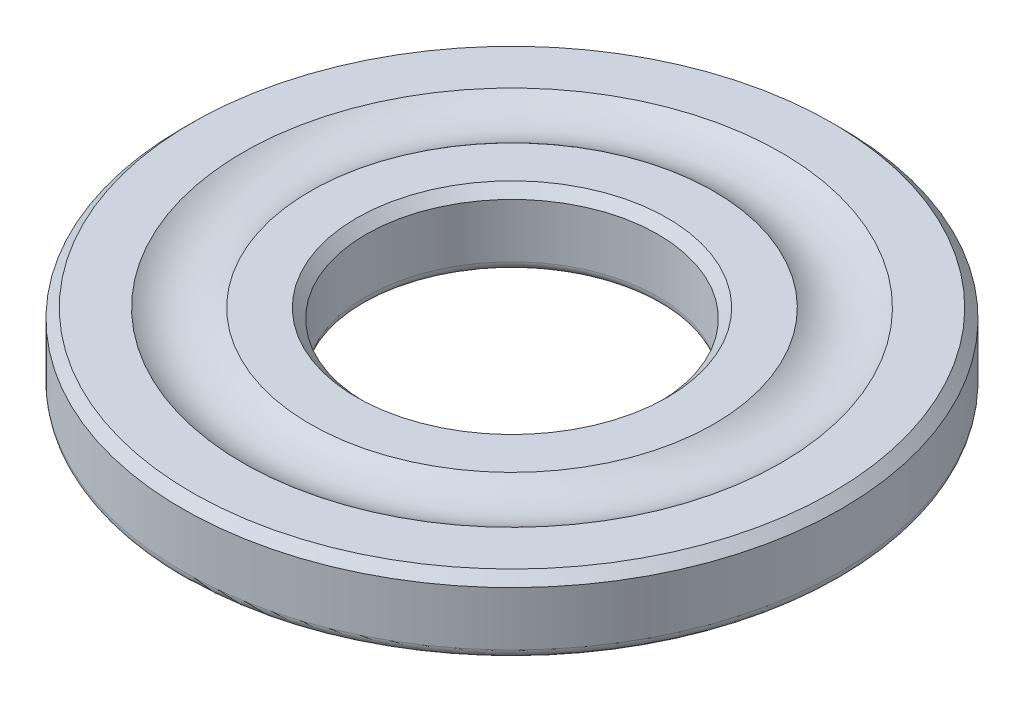
ISO-10303-21;
HEADER;
FILE_DESCRIPTION(('STEP AP214'),'2;1');
FILE_NAME('part.step','',(''),(''),'','','');
FILE_SCHEMA(('AUTOMOTIVE_DESIGN { 1 0 10303 214 1 1 1 1 }'));
ENDSEC;
DATA;
#1=APPLICATION_CONTEXT('core data for automotive mechanical design processes');
#2=APPLICATION_PROTOCOL_DEFINITION('international standard','automotive_design',2000,#1);
#3=PRODUCT_CONTEXT('',#1,'mechanical');
#4=PRODUCT('Part','Part','',(#3));
#5=PRODUCT_RELATED_PRODUCT_CATEGORY('part','',(#4));
#6=PRODUCT_DEFINITION_FORMATION('','',#4);
#7=PRODUCT_DEFINITION_CONTEXT('part definition',#1,'design');
#8=PRODUCT_DEFINITION('design','',#6,#7);
#9=PRODUCT_DEFINITION_SHAPE('','',#8);
#10=(LENGTH_UNIT() NAMED_UNIT(*) SI_UNIT(.MILLI.,.METRE.));
#11=(NAMED_UNIT(*) PLANE_ANGLE_UNIT() SI_UNIT($,.RADIAN.));
#12=(NAMED_UNIT(*) SI_UNIT($,.STERADIAN.) SOLID_ANGLE_UNIT());
#13=UNCERTAINTY_MEASURE_WITH_UNIT(LENGTH_MEASURE(1.E-05),#10,'distance_accuracy_value','');
#14=(GEOMETRIC_REPRESENTATION_CONTEXT(3) GLOBAL_UNCERTAINTY_ASSIGNED_CONTEXT((#13)) GLOBAL_UNIT_ASSIGNED_CONTEXT((#10,
#11,#12)) REPRESENTATION_CONTEXT('',''));
#15=CARTESIAN_POINT('',(0.,0.,0.));
#16=DIRECTION('',(0.,0.,1.));
#17=DIRECTION('',(1.,0.,0.));
#18=AXIS2_PLACEMENT_3D('',#15,#16,#17);
#19=CARTESIAN_POINT('',(5.05,0.,0.));
#20=DIRECTION('',(0.,-1.,0.));
#21=DIRECTION('',(-1.,0.,0.));
#22=AXIS2_PLACEMENT_3D('',#19,#20,#21);
#23=PLANE('',#22);
#24=CARTESIAN_POINT('',(0.,0.,0.));
#25=DIRECTION('',(0.,1.,0.));
#26=DIRECTION('',(1.,0.,0.));
#27=AXIS2_PLACEMENT_3D('',#24,#25,#26);
#28=CIRCLE('',#27,3.3);
#29=CARTESIAN_POINT('',(3.3,0.,0.));
#30=VERTEX_POINT('',#29);
#31=EDGE_CURVE('E11',#30,#30,#28,.T.);
#32=ORIENTED_EDGE('',*,*,#31,.T.);
#33=EDGE_LOOP('',(#32));
#34=FACE_BOUND('',#33,.T.);
#35=CARTESIAN_POINT('',(0.,0.,0.));
#36=DIRECTION('',(0.,1.,0.));
#37=DIRECTION('',(1.,0.,0.));
#38=AXIS2_PLACEMENT_3D('',#35,#36,#37);
#39=CIRCLE('',#38,6.8);
#40=CARTESIAN_POINT('',(6.8,0.,0.));
#41=VERTEX_POINT('',#40);
#42=EDGE_CURVE('E71',#41,#41,#39,.T.);
#43=ORIENTED_EDGE('',*,*,#42,.F.);
#44=EDGE_LOOP('',(#43));
#45=FACE_BOUND('',#44,.T.);
#46=ADVANCED_FACE('F16',(#34,#45),#23,.T.);
#47=CARTESIAN_POINT('',(0.,0.2,0.));
#48=DIRECTION('',(0.,1.,0.));
#49=DIRECTION('',(0.,0.,1.));
#50=AXIS2_PLACEMENT_3D('',#47,#48,#49);
#51=TOROIDAL_SURFACE('',#50,3.3,0.2);
#52=CARTESIAN_POINT('',(0.,0.2,0.));
#53=DIRECTION('',(0.,1.,0.));
#54=DIRECTION('',(1.,0.,0.));
#55=AXIS2_PLACEMENT_3D('',#52,#53,#54);
#56=CIRCLE('',#55,3.1);
#57=CARTESIAN_POINT('',(3.1,0.2,0.));
#58=VERTEX_POINT('',#57);
#59=EDGE_CURVE('E20',#58,#58,#56,.T.);
#60=ORIENTED_EDGE('',*,*,#59,.T.);
#61=EDGE_LOOP('',(#60));
#62=FACE_BOUND('',#61,.T.);
#63=ORIENTED_EDGE('',*,*,#31,.F.);
#64=EDGE_LOOP('',(#63));
#65=FACE_BOUND('',#64,.T.);
#66=ADVANCED_FACE('F80',(#62,#65),#51,.T.);
#67=CARTESIAN_POINT('',(0.,0.7738,0.));
#68=DIRECTION('',(0.,-1.,0.));
#69=DIRECTION('',(1.,0.,0.));
#70=AXIS2_PLACEMENT_3D('',#67,#68,#69);
#71=CYLINDRICAL_SURFACE('',#70,3.1);
#72=CARTESIAN_POINT('',(0.,1.3476,0.));
#73=DIRECTION('',(0.,1.,0.));
#74=DIRECTION('',(1.,0.,0.));
#75=AXIS2_PLACEMENT_3D('',#72,#73,#74);
#76=CIRCLE('',#75,3.1);
#77=CARTESIAN_POINT('',(3.1,1.3476,0.));
#78=VERTEX_POINT('',#77);
#79=EDGE_CURVE('E59',#78,#78,#76,.T.);
#80=ORIENTED_EDGE('',*,*,#79,.T.);
#81=EDGE_LOOP('',(#80));
#82=FACE_BOUND('',#81,.T.);
#83=ORIENTED_EDGE('',*,*,#59,.F.);
#84=EDGE_LOOP('',(#83));
#85=FACE_BOUND('',#84,.T.);
#86=ADVANCED_FACE('F86',(#82,#85),#71,.F.);
#87=CARTESIAN_POINT('',(0.,1.4476,0.));
#88=DIRECTION('',(0.,1.,0.));
#89=DIRECTION('',(1.,0.,0.));
#90=AXIS2_PLACEMENT_3D('',#87,#88,#89);
#91=CONICAL_SURFACE('',#90,3.2,0.78539816339745);
#92=CARTESIAN_POINT('',(0.,1.5476,0.));
#93=DIRECTION('',(0.,1.,0.));
#94=DIRECTION('',(1.,0.,0.));
#95=AXIS2_PLACEMENT_3D('',#92,#93,#94);
#96=CIRCLE('',#95,3.3);
#97=CARTESIAN_POINT('',(3.3,1.5476,0.));
#98=VERTEX_POINT('',#97);
#99=EDGE_CURVE('E55',#98,#98,#96,.T.);
#100=ORIENTED_EDGE('',*,*,#99,.T.);
#101=EDGE_LOOP('',(#100));
#102=FACE_BOUND('',#101,.T.);
#103=ORIENTED_EDGE('',*,*,#79,.F.);
#104=EDGE_LOOP('',(#103));
#105=FACE_BOUND('',#104,.T.);
#106=ADVANCED_FACE('F56',(#102,#105),#91,.F.);
#107=CARTESIAN_POINT('',(3.79285,1.5476,0.));
#108=DIRECTION('',(0.,1.,0.));
#109=DIRECTION('',(1.,0.,0.));
#110=AXIS2_PLACEMENT_3D('',#107,#108,#109);
#111=PLANE('',#110);
#112=CARTESIAN_POINT('',(0.,1.5476,0.));
#113=DIRECTION('',(0.,1.,0.));
#114=DIRECTION('',(1.,0.,0.));
#115=AXIS2_PLACEMENT_3D('',#112,#113,#114);
#116=CIRCLE('',#115,4.2857);
#117=CARTESIAN_POINT('',(4.2857,1.5476,0.));
#118=VERTEX_POINT('',#117);
#119=EDGE_CURVE('E60',#118,#118,#116,.T.);
#120=ORIENTED_EDGE('',*,*,#119,.T.);
#121=EDGE_LOOP('',(#120));
#122=FACE_BOUND('',#121,.T.);
#123=ORIENTED_EDGE('',*,*,#99,.F.);
#124=EDGE_LOOP('',(#123));
#125=FACE_BOUND('',#124,.T.);
#126=ADVANCED_FACE('F18',(#122,#125),#111,.T.);
#127=CARTESIAN_POINT('',(0.,2.5,0.));
#128=DIRECTION('',(0.,1.,0.));
#129=DIRECTION('',(0.,0.,1.));
#130=AXIS2_PLACEMENT_3D('',#127,#128,#129);
#131=TOROIDAL_SURFACE('',#130,5.,1.1905);
#132=CARTESIAN_POINT('',(0.,1.5476,0.));
#133=DIRECTION('',(0.,1.,0.));
#134=DIRECTION('',(1.,0.,0.));
#135=AXIS2_PLACEMENT_3D('',#132,#133,#134);
#136=CIRCLE('',#135,5.7143);
#137=CARTESIAN_POINT('',(5.7143,1.5476,0.));
#138=VERTEX_POINT('',#137);
#139=EDGE_CURVE('E62',#138,#138,#136,.T.);
#140=ORIENTED_EDGE('',*,*,#139,.T.);
#141=EDGE_LOOP('',(#140));
#142=FACE_BOUND('',#141,.T.);
#143=ORIENTED_EDGE('',*,*,#119,.F.);
#144=EDGE_LOOP('',(#143));
#145=FACE_BOUND('',#144,.T.);
#146=ADVANCED_FACE('F96',(#142,#145),#131,.F.);
#147=CARTESIAN_POINT('',(6.25715,1.5476,0.));
#148=DIRECTION('',(0.,1.,0.));
#149=DIRECTION('',(1.,0.,0.));
#150=AXIS2_PLACEMENT_3D('',#147,#148,#149);
#151=PLANE('',#150);
#152=CARTESIAN_POINT('',(0.,1.5476,0.));
#153=DIRECTION('',(0.,1.,0.));
#154=DIRECTION('',(1.,0.,0.));
#155=AXIS2_PLACEMENT_3D('',#152,#153,#154);
#156=CIRCLE('',#155,6.8);
#157=CARTESIAN_POINT('',(6.8,1.5476,0.));
#158=VERTEX_POINT('',#157);
#159=EDGE_CURVE('E66',#158,#158,#156,.T.);
#160=ORIENTED_EDGE('',*,*,#159,.T.);
#161=EDGE_LOOP('',(#160));
#162=FACE_BOUND('',#161,.T.);
#163=ORIENTED_EDGE('',*,*,#139,.F.);
#164=EDGE_LOOP('',(#163));
#165=FACE_BOUND('',#164,.T.);
#166=ADVANCED_FACE('F92',(#162,#165),#151,.T.);
#167=CARTESIAN_POINT('',(0.,1.4476,0.));
#168=DIRECTION('',(0.,-1.,0.));
#169=DIRECTION('',(1.,0.,0.));
#170=AXIS2_PLACEMENT_3D('',#167,#168,#169);
#171=CONICAL_SURFACE('',#170,6.9,0.785398163397446);
#172=CARTESIAN_POINT('',(0.,1.3476,0.));
#173=DIRECTION('',(0.,1.,0.));
#174=DIRECTION('',(1.,0.,0.));
#175=AXIS2_PLACEMENT_3D('',#172,#173,#174);
#176=CIRCLE('',#175,7.);
#177=CARTESIAN_POINT('',(7.,1.3476,0.));
#178=VERTEX_POINT('',#177);
#179=EDGE_CURVE('E68',#178,#178,#176,.T.);
#180=ORIENTED_EDGE('',*,*,#179,.T.);
#181=EDGE_LOOP('',(#180));
#182=FACE_BOUND('',#181,.T.);
#183=ORIENTED_EDGE('',*,*,#159,.F.);
#184=EDGE_LOOP('',(#183));
#185=FACE_BOUND('',#184,.T.);
#186=ADVANCED_FACE('F95',(#182,#185),#171,.T.);
#187=CARTESIAN_POINT('',(0.,0.7738,0.));
#188=DIRECTION('',(0.,-1.,0.));
#189=DIRECTION('',(1.,0.,0.));
#190=AXIS2_PLACEMENT_3D('',#187,#188,#189);
#191=CYLINDRICAL_SURFACE('',#190,7.);
#192=CARTESIAN_POINT('',(0.,0.2,0.));
#193=DIRECTION('',(0.,1.,0.));
#194=DIRECTION('',(1.,0.,0.));
#195=AXIS2_PLACEMENT_3D('',#192,#193,#194);
#196=CIRCLE('',#195,7.);
#197=CARTESIAN_POINT('',(7.,0.2,0.));
#198=VERTEX_POINT('',#197);
#199=EDGE_CURVE('E69',#198,#198,#196,.T.);
#200=ORIENTED_EDGE('',*,*,#199,.T.);
#201=EDGE_LOOP('',(#200));
#202=FACE_BOUND('',#201,.T.);
#203=ORIENTED_EDGE('',*,*,#179,.F.);
#204=EDGE_LOOP('',(#203));
#205=FACE_BOUND('',#204,.T.);
#206=ADVANCED_FACE('F98',(#202,#205),#191,.T.);
#207=CARTESIAN_POINT('',(0.,0.2,0.));
#208=DIRECTION('',(0.,1.,0.));
#209=DIRECTION('',(0.,0.,1.));
#210=AXIS2_PLACEMENT_3D('',#207,#208,#209);
#211=TOROIDAL_SURFACE('',#210,6.8,0.2);
#212=ORIENTED_EDGE('',*,*,#42,.T.);
#213=EDGE_LOOP('',(#212));
#214=FACE_BOUND('',#213,.T.);
#215=ORIENTED_EDGE('',*,*,#199,.F.);
#216=EDGE_LOOP('',(#215));
#217=FACE_BOUND('',#216,.T.);
#218=ADVANCED_FACE('F76',(#214,#217),#211,.T.);
#219=CLOSED_SHELL('',(#46,#66,#86,#106,#126,#146,#166,#186,#206,#218));
#220=MANIFOLD_SOLID_BREP('B1',#219);
#221=ADVANCED_BREP_SHAPE_REPRESENTATION('',(#18,#220),#14);
#222=SHAPE_DEFINITION_REPRESENTATION(#9,#221);
ENDSEC;
END-ISO-10303-21;
